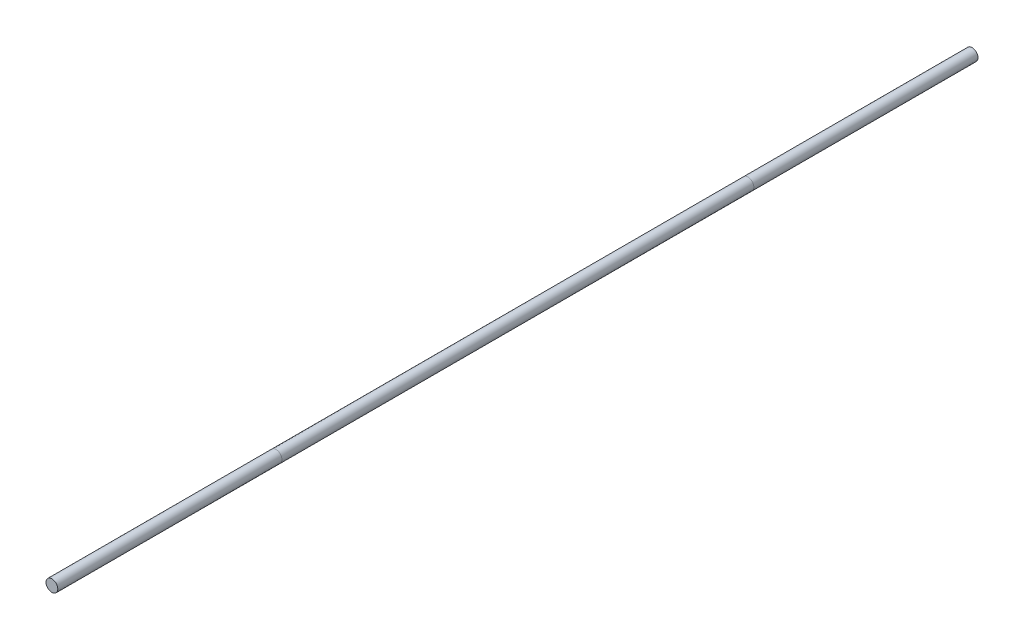
ISO-10303-21;
HEADER;
FILE_DESCRIPTION(('STEP AP214'),'2;1');
FILE_NAME('part.step','',(''),(''),'','','');
FILE_SCHEMA(('AUTOMOTIVE_DESIGN { 1 0 10303 214 1 1 1 1 }'));
ENDSEC;
DATA;
#1=APPLICATION_CONTEXT('core data for automotive mechanical design processes');
#2=APPLICATION_PROTOCOL_DEFINITION('international standard','automotive_design',2000,#1);
#3=PRODUCT_CONTEXT('',#1,'mechanical');
#4=PRODUCT('Part','Part','',(#3));
#5=PRODUCT_RELATED_PRODUCT_CATEGORY('part','',(#4));
#6=PRODUCT_DEFINITION_FORMATION('','',#4);
#7=PRODUCT_DEFINITION_CONTEXT('part definition',#1,'design');
#8=PRODUCT_DEFINITION('design','',#6,#7);
#9=PRODUCT_DEFINITION_SHAPE('','',#8);
#10=(LENGTH_UNIT() NAMED_UNIT(*) SI_UNIT(.MILLI.,.METRE.));
#11=(NAMED_UNIT(*) PLANE_ANGLE_UNIT() SI_UNIT($,.RADIAN.));
#12=(NAMED_UNIT(*) SI_UNIT($,.STERADIAN.) SOLID_ANGLE_UNIT());
#13=UNCERTAINTY_MEASURE_WITH_UNIT(LENGTH_MEASURE(1.E-05),#10,'distance_accuracy_value','');
#14=(GEOMETRIC_REPRESENTATION_CONTEXT(3) GLOBAL_UNCERTAINTY_ASSIGNED_CONTEXT((#13)) GLOBAL_UNIT_ASSIGNED_CONTEXT((#10,
#11,#12)) REPRESENTATION_CONTEXT('',''));
#15=CARTESIAN_POINT('',(0.,0.,0.));
#16=DIRECTION('',(0.,0.,1.));
#17=DIRECTION('',(1.,0.,0.));
#18=AXIS2_PLACEMENT_3D('',#15,#16,#17);
#19=CARTESIAN_POINT('',(0.,0.,247.65));
#20=DIRECTION('',(0.,0.,-1.));
#21=DIRECTION('',(-1.,0.,0.));
#22=AXIS2_PLACEMENT_3D('',#19,#20,#21);
#23=CYLINDRICAL_SURFACE('',#22,3.175);
#24=CARTESIAN_POINT('',(0.,0.,127.));
#25=DIRECTION('',(0.,0.,1.));
#26=DIRECTION('',(1.,0.,0.));
#27=AXIS2_PLACEMENT_3D('',#24,#25,#26);
#28=CIRCLE('',#27,3.175);
#29=CARTESIAN_POINT('',(3.175,0.,127.));
#30=VERTEX_POINT('',#29);
#31=EDGE_CURVE('E44',#30,#30,#28,.T.);
#32=ORIENTED_EDGE('',*,*,#31,.F.);
#33=EDGE_LOOP('',(#32));
#34=FACE_BOUND('',#33,.T.);
#35=CARTESIAN_POINT('',(0.,0.,-127.));
#36=DIRECTION('',(0.,0.,1.));
#37=DIRECTION('',(1.,0.,0.));
#38=AXIS2_PLACEMENT_3D('',#35,#36,#37);
#39=CIRCLE('',#38,3.175);
#40=CARTESIAN_POINT('',(3.175,0.,-127.));
#41=VERTEX_POINT('',#40);
#42=EDGE_CURVE('E11',#41,#41,#39,.T.);
#43=ORIENTED_EDGE('',*,*,#42,.T.);
#44=EDGE_LOOP('',(#43));
#45=FACE_BOUND('',#44,.T.);
#46=ADVANCED_FACE('F37',(#34,#45),#23,.T.);
#47=CARTESIAN_POINT('',(0.,0.,247.65));
#48=DIRECTION('',(0.,0.,1.));
#49=DIRECTION('',(1.,0.,0.));
#50=AXIS2_PLACEMENT_3D('',#47,#48,#49);
#51=CIRCLE('',#50,3.175);
#52=CARTESIAN_POINT('',(3.175,0.,247.65));
#53=VERTEX_POINT('',#52);
#54=EDGE_CURVE('E48',#53,#53,#51,.T.);
#55=ORIENTED_EDGE('',*,*,#54,.F.);
#56=EDGE_LOOP('',(#55));
#57=FACE_BOUND('',#56,.T.);
#58=ORIENTED_EDGE('',*,*,#31,.T.);
#59=EDGE_LOOP('',(#58));
#60=FACE_BOUND('',#59,.T.);
#61=ADVANCED_FACE('F68',(#57,#60),#23,.T.);
#62=ORIENTED_EDGE('',*,*,#42,.F.);
#63=EDGE_LOOP('',(#62));
#64=FACE_BOUND('',#63,.T.);
#65=CARTESIAN_POINT('',(0.,0.,-247.65));
#66=DIRECTION('',(0.,0.,1.));
#67=DIRECTION('',(1.,0.,0.));
#68=AXIS2_PLACEMENT_3D('',#65,#66,#67);
#69=CIRCLE('',#68,3.175);
#70=CARTESIAN_POINT('',(3.175,0.,-247.65));
#71=VERTEX_POINT('',#70);
#72=EDGE_CURVE('E52',#71,#71,#69,.T.);
#73=ORIENTED_EDGE('',*,*,#72,.T.);
#74=EDGE_LOOP('',(#73));
#75=FACE_BOUND('',#74,.T.);
#76=ADVANCED_FACE('F39',(#64,#75),#23,.T.);
#77=CARTESIAN_POINT('',(0.,0.,247.65));
#78=DIRECTION('',(0.,0.,1.));
#79=DIRECTION('',(1.,0.,0.));
#80=AXIS2_PLACEMENT_3D('',#77,#78,#79);
#81=PLANE('',#80);
#82=ORIENTED_EDGE('',*,*,#54,.T.);
#83=EDGE_LOOP('',(#82));
#84=FACE_BOUND('',#83,.T.);
#85=ADVANCED_FACE('F61',(#84),#81,.T.);
#86=CARTESIAN_POINT('',(0.,0.,-247.65));
#87=DIRECTION('',(0.,0.,1.));
#88=DIRECTION('',(1.,0.,0.));
#89=AXIS2_PLACEMENT_3D('',#86,#87,#88);
#90=PLANE('',#89);
#91=ORIENTED_EDGE('',*,*,#72,.F.);
#92=EDGE_LOOP('',(#91));
#93=FACE_BOUND('',#92,.T.);
#94=ADVANCED_FACE('F59',(#93),#90,.F.);
#95=CLOSED_SHELL('',(#46,#61,#76,#85,#94));
#96=MANIFOLD_SOLID_BREP('B2',#95);
#97=ADVANCED_BREP_SHAPE_REPRESENTATION('',(#18,#96),#14);
#98=SHAPE_DEFINITION_REPRESENTATION(#9,#97);
ENDSEC;
END-ISO-10303-21;
